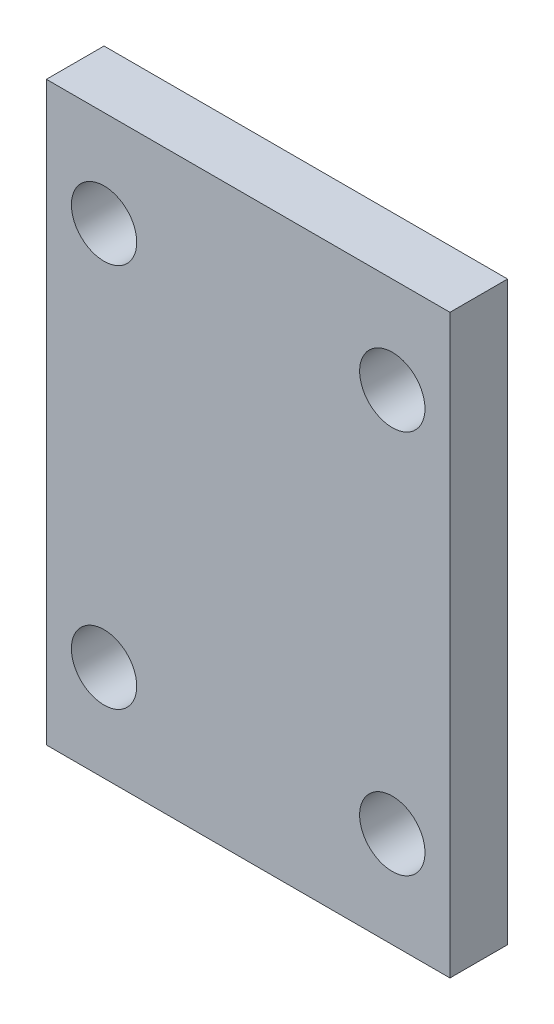
ISO-10303-21;
HEADER;
FILE_DESCRIPTION(('STEP AP214'),'2;1');
FILE_NAME('part.step','',(''),(''),'','','');
FILE_SCHEMA(('AUTOMOTIVE_DESIGN { 1 0 10303 214 1 1 1 1 }'));
ENDSEC;
DATA;
#1=APPLICATION_CONTEXT('core data for automotive mechanical design processes');
#2=APPLICATION_PROTOCOL_DEFINITION('international standard','automotive_design',2000,#1);
#3=PRODUCT_CONTEXT('',#1,'mechanical');
#4=PRODUCT('Part','Part','',(#3));
#5=PRODUCT_RELATED_PRODUCT_CATEGORY('part','',(#4));
#6=PRODUCT_DEFINITION_FORMATION('','',#4);
#7=PRODUCT_DEFINITION_CONTEXT('part definition',#1,'design');
#8=PRODUCT_DEFINITION('design','',#6,#7);
#9=PRODUCT_DEFINITION_SHAPE('','',#8);
#10=(LENGTH_UNIT() NAMED_UNIT(*) SI_UNIT(.MILLI.,.METRE.));
#11=(NAMED_UNIT(*) PLANE_ANGLE_UNIT() SI_UNIT($,.RADIAN.));
#12=(NAMED_UNIT(*) SI_UNIT($,.STERADIAN.) SOLID_ANGLE_UNIT());
#13=UNCERTAINTY_MEASURE_WITH_UNIT(LENGTH_MEASURE(1.E-05),#10,'distance_accuracy_value','');
#14=(GEOMETRIC_REPRESENTATION_CONTEXT(3) GLOBAL_UNCERTAINTY_ASSIGNED_CONTEXT((#13)) GLOBAL_UNIT_ASSIGNED_CONTEXT((#10,
#11,#12)) REPRESENTATION_CONTEXT('',''));
#15=CARTESIAN_POINT('',(0.,0.,0.));
#16=DIRECTION('',(0.,0.,1.));
#17=DIRECTION('',(1.,0.,0.));
#18=AXIS2_PLACEMENT_3D('',#15,#16,#17);
#19=CARTESIAN_POINT('',(0.,0.,0.001215219718688));
#20=DIRECTION('',(0.,0.,1.));
#21=DIRECTION('',(1.,0.,0.));
#22=AXIS2_PLACEMENT_3D('',#19,#20,#21);
#23=PLANE('',#22);
#24=CARTESIAN_POINT('',(18.,25.,0.001215219718915));
#25=DIRECTION('',(0.,0.,1.));
#26=DIRECTION('',(1.,0.,0.));
#27=AXIS2_PLACEMENT_3D('',#24,#25,#26);
#28=CIRCLE('',#27,1.7);
#29=CARTESIAN_POINT('',(19.7,25.,0.001215219718915));
#30=VERTEX_POINT('',#29);
#31=EDGE_CURVE('E90',#30,#30,#28,.T.);
#32=ORIENTED_EDGE('',*,*,#31,.T.);
#33=EDGE_LOOP('',(#32));
#34=FACE_BOUND('',#33,.T.);
#35=CARTESIAN_POINT('',(3.,25.,0.001215219718915));
#36=DIRECTION('',(0.,0.,1.));
#37=DIRECTION('',(1.,0.,0.));
#38=AXIS2_PLACEMENT_3D('',#35,#36,#37);
#39=CIRCLE('',#38,1.7);
#40=CARTESIAN_POINT('',(4.7,25.,0.001215219718915));
#41=VERTEX_POINT('',#40);
#42=EDGE_CURVE('E94',#41,#41,#39,.T.);
#43=ORIENTED_EDGE('',*,*,#42,.T.);
#44=EDGE_LOOP('',(#43));
#45=FACE_BOUND('',#44,.T.);
#46=CARTESIAN_POINT('',(18.,5.,0.001215219718915));
#47=DIRECTION('',(0.,0.,1.));
#48=DIRECTION('',(1.,0.,0.));
#49=AXIS2_PLACEMENT_3D('',#46,#47,#48);
#50=CIRCLE('',#49,1.7);
#51=CARTESIAN_POINT('',(19.7,5.,0.001215219718915));
#52=VERTEX_POINT('',#51);
#53=EDGE_CURVE('E96',#52,#52,#50,.T.);
#54=ORIENTED_EDGE('',*,*,#53,.T.);
#55=EDGE_LOOP('',(#54));
#56=FACE_BOUND('',#55,.T.);
#57=CARTESIAN_POINT('',(3.,5.,0.001215219718915));
#58=DIRECTION('',(0.,0.,1.));
#59=DIRECTION('',(1.,0.,0.));
#60=AXIS2_PLACEMENT_3D('',#57,#58,#59);
#61=CIRCLE('',#60,1.7);
#62=CARTESIAN_POINT('',(4.7,5.,0.001215219718915));
#63=VERTEX_POINT('',#62);
#64=EDGE_CURVE('E19',#63,#63,#61,.T.);
#65=ORIENTED_EDGE('',*,*,#64,.T.);
#66=EDGE_LOOP('',(#65));
#67=FACE_BOUND('',#66,.T.);
#68=DIRECTION('',(0.,1.,0.));
#69=VECTOR('',#68,1.);
#70=CARTESIAN_POINT('',(21.,0.,0.001215219718915));
#71=LINE('',#70,#69);
#72=CARTESIAN_POINT('',(21.,0.,0.00121521971885825));
#73=VERTEX_POINT('',#72);
#74=CARTESIAN_POINT('',(21.,30.,0.0012152197188015));
#75=VERTEX_POINT('',#74);
#76=EDGE_CURVE('E61',#73,#75,#71,.T.);
#77=ORIENTED_EDGE('',*,*,#76,.F.);
#78=DIRECTION('',(1.,0.,0.));
#79=VECTOR('',#78,1.);
#80=CARTESIAN_POINT('',(0.,0.,0.001215219718915));
#81=LINE('',#80,#79);
#82=CARTESIAN_POINT('',(0.,0.,0.0012152197188015));
#83=VERTEX_POINT('',#82);
#84=EDGE_CURVE('E55',#73,#83,#81,.F.);
#85=ORIENTED_EDGE('',*,*,#84,.T.);
#86=DIRECTION('',(0.,1.,0.));
#87=VECTOR('',#86,1.);
#88=CARTESIAN_POINT('',(0.,0.,0.001215219718915));
#89=LINE('',#88,#87);
#90=CARTESIAN_POINT('',(0.,30.,0.0012152197188015));
#91=VERTEX_POINT('',#90);
#92=EDGE_CURVE('E59',#83,#91,#89,.T.);
#93=ORIENTED_EDGE('',*,*,#92,.T.);
#94=DIRECTION('',(1.,0.,0.));
#95=VECTOR('',#94,1.);
#96=CARTESIAN_POINT('',(0.,30.,0.001215219718915));
#97=LINE('',#96,#95);
#98=EDGE_CURVE('E105',#75,#91,#97,.F.);
#99=ORIENTED_EDGE('',*,*,#98,.F.);
#100=EDGE_LOOP('',(#77,#85,#93,#99));
#101=FACE_BOUND('',#100,.T.);
#102=ADVANCED_FACE('F16',(#34,#45,#56,#67,#101),#23,.F.);
#103=CARTESIAN_POINT('',(0.,0.,0.001215219718688));
#104=DIRECTION('',(1.,0.,0.));
#105=DIRECTION('',(0.,0.,-1.));
#106=AXIS2_PLACEMENT_3D('',#103,#104,#105);
#107=PLANE('',#106);
#108=DIRECTION('',(0.,0.,1.));
#109=VECTOR('',#108,1.);
#110=CARTESIAN_POINT('',(0.,30.,0.001215219718688));
#111=LINE('',#110,#109);
#112=CARTESIAN_POINT('',(0.,30.,3.001215219719));
#113=VERTEX_POINT('',#112);
#114=EDGE_CURVE('E69',#91,#113,#111,.T.);
#115=ORIENTED_EDGE('',*,*,#114,.F.);
#116=ORIENTED_EDGE('',*,*,#92,.F.);
#117=DIRECTION('',(0.,0.,1.));
#118=VECTOR('',#117,1.);
#119=CARTESIAN_POINT('',(0.,0.,0.001215219718688));
#120=LINE('',#119,#118);
#121=CARTESIAN_POINT('',(0.,0.,3.001215219719));
#122=VERTEX_POINT('',#121);
#123=EDGE_CURVE('E63',#83,#122,#120,.T.);
#124=ORIENTED_EDGE('',*,*,#123,.T.);
#125=DIRECTION('',(0.,1.,0.));
#126=VECTOR('',#125,1.);
#127=CARTESIAN_POINT('',(0.,0.,3.001215219719));
#128=LINE('',#127,#126);
#129=EDGE_CURVE('E93',#113,#122,#128,.F.);
#130=ORIENTED_EDGE('',*,*,#129,.F.);
#131=EDGE_LOOP('',(#115,#116,#124,#130));
#132=FACE_BOUND('',#131,.T.);
#133=ADVANCED_FACE('F66',(#132),#107,.F.);
#134=CARTESIAN_POINT('',(0.,0.,0.001215219718688));
#135=DIRECTION('',(0.,1.,0.));
#136=DIRECTION('',(0.,0.,1.));
#137=AXIS2_PLACEMENT_3D('',#134,#135,#136);
#138=PLANE('',#137);
#139=DIRECTION('',(1.,0.,0.));
#140=VECTOR('',#139,1.);
#141=CARTESIAN_POINT('',(0.,0.,3.001215219719));
#142=LINE('',#141,#140);
#143=CARTESIAN_POINT('',(21.,0.,3.001215219719));
#144=VERTEX_POINT('',#143);
#145=EDGE_CURVE('E74',#122,#144,#142,.T.);
#146=ORIENTED_EDGE('',*,*,#145,.F.);
#147=ORIENTED_EDGE('',*,*,#123,.F.);
#148=ORIENTED_EDGE('',*,*,#84,.F.);
#149=DIRECTION('',(0.,0.,-1.));
#150=VECTOR('',#149,1.);
#151=CARTESIAN_POINT('',(21.,0.,0.001215219718688));
#152=LINE('',#151,#150);
#153=EDGE_CURVE('E76',#144,#73,#152,.T.);
#154=ORIENTED_EDGE('',*,*,#153,.F.);
#155=EDGE_LOOP('',(#146,#147,#148,#154));
#156=FACE_BOUND('',#155,.T.);
#157=ADVANCED_FACE('F72',(#156),#138,.F.);
#158=CARTESIAN_POINT('',(21.,0.,0.001215219718688));
#159=DIRECTION('',(1.,0.,0.));
#160=DIRECTION('',(0.,0.,-1.));
#161=AXIS2_PLACEMENT_3D('',#158,#159,#160);
#162=PLANE('',#161);
#163=DIRECTION('',(0.,0.,1.));
#164=VECTOR('',#163,1.);
#165=CARTESIAN_POINT('',(21.,30.,0.001215219718688));
#166=LINE('',#165,#164);
#167=CARTESIAN_POINT('',(21.,30.,3.001215219719));
#168=VERTEX_POINT('',#167);
#169=EDGE_CURVE('E34',#168,#75,#166,.F.);
#170=ORIENTED_EDGE('',*,*,#169,.F.);
#171=DIRECTION('',(0.,1.,0.));
#172=VECTOR('',#171,1.);
#173=CARTESIAN_POINT('',(21.,0.,3.001215219719));
#174=LINE('',#173,#172);
#175=EDGE_CURVE('E112',#144,#168,#174,.T.);
#176=ORIENTED_EDGE('',*,*,#175,.F.);
#177=ORIENTED_EDGE('',*,*,#153,.T.);
#178=ORIENTED_EDGE('',*,*,#76,.T.);
#179=EDGE_LOOP('',(#170,#176,#177,#178));
#180=FACE_BOUND('',#179,.T.);
#181=ADVANCED_FACE('F110',(#180),#162,.T.);
#182=CARTESIAN_POINT('',(0.,30.,0.001215219718688));
#183=DIRECTION('',(0.,1.,0.));
#184=DIRECTION('',(0.,0.,1.));
#185=AXIS2_PLACEMENT_3D('',#182,#183,#184);
#186=PLANE('',#185);
#187=DIRECTION('',(1.,0.,0.));
#188=VECTOR('',#187,1.);
#189=CARTESIAN_POINT('',(0.,30.,3.001215219719));
#190=LINE('',#189,#188);
#191=EDGE_CURVE('E89',#168,#113,#190,.F.);
#192=ORIENTED_EDGE('',*,*,#191,.F.);
#193=ORIENTED_EDGE('',*,*,#169,.T.);
#194=ORIENTED_EDGE('',*,*,#98,.T.);
#195=ORIENTED_EDGE('',*,*,#114,.T.);
#196=EDGE_LOOP('',(#192,#193,#194,#195));
#197=FACE_BOUND('',#196,.T.);
#198=ADVANCED_FACE('F118',(#197),#186,.T.);
#199=CARTESIAN_POINT('',(3.,5.,0.001215219718688));
#200=DIRECTION('',(0.,0.,1.));
#201=DIRECTION('',(1.,0.,0.));
#202=AXIS2_PLACEMENT_3D('',#199,#200,#201);
#203=CYLINDRICAL_SURFACE('',#202,1.7);
#204=ORIENTED_EDGE('',*,*,#64,.F.);
#205=EDGE_LOOP('',(#204));
#206=FACE_BOUND('',#205,.T.);
#207=CARTESIAN_POINT('',(3.,5.,3.001215219719));
#208=DIRECTION('',(0.,0.,1.));
#209=DIRECTION('',(1.,0.,0.));
#210=AXIS2_PLACEMENT_3D('',#207,#208,#209);
#211=CIRCLE('',#210,1.7);
#212=CARTESIAN_POINT('',(4.7,5.,3.001215219719));
#213=VERTEX_POINT('',#212);
#214=EDGE_CURVE('E86',#213,#213,#211,.F.);
#215=ORIENTED_EDGE('',*,*,#214,.F.);
#216=EDGE_LOOP('',(#215));
#217=FACE_BOUND('',#216,.T.);
#218=ADVANCED_FACE('F120',(#206,#217),#203,.F.);
#219=CARTESIAN_POINT('',(18.,5.,0.001215219718688));
#220=DIRECTION('',(0.,0.,1.));
#221=DIRECTION('',(1.,0.,0.));
#222=AXIS2_PLACEMENT_3D('',#219,#220,#221);
#223=CYLINDRICAL_SURFACE('',#222,1.7);
#224=ORIENTED_EDGE('',*,*,#53,.F.);
#225=EDGE_LOOP('',(#224));
#226=FACE_BOUND('',#225,.T.);
#227=CARTESIAN_POINT('',(18.,5.,3.001215219719));
#228=DIRECTION('',(0.,0.,1.));
#229=DIRECTION('',(1.,0.,0.));
#230=AXIS2_PLACEMENT_3D('',#227,#228,#229);
#231=CIRCLE('',#230,1.7);
#232=CARTESIAN_POINT('',(19.7,5.,3.001215219719));
#233=VERTEX_POINT('',#232);
#234=EDGE_CURVE('E83',#233,#233,#231,.F.);
#235=ORIENTED_EDGE('',*,*,#234,.F.);
#236=EDGE_LOOP('',(#235));
#237=FACE_BOUND('',#236,.T.);
#238=ADVANCED_FACE('F127',(#226,#237),#223,.F.);
#239=CARTESIAN_POINT('',(3.,25.,0.001215219718688));
#240=DIRECTION('',(0.,0.,1.));
#241=DIRECTION('',(1.,0.,0.));
#242=AXIS2_PLACEMENT_3D('',#239,#240,#241);
#243=CYLINDRICAL_SURFACE('',#242,1.7);
#244=ORIENTED_EDGE('',*,*,#42,.F.);
#245=EDGE_LOOP('',(#244));
#246=FACE_BOUND('',#245,.T.);
#247=CARTESIAN_POINT('',(3.,25.,3.001215219719));
#248=DIRECTION('',(0.,0.,1.));
#249=DIRECTION('',(1.,0.,0.));
#250=AXIS2_PLACEMENT_3D('',#247,#248,#249);
#251=CIRCLE('',#250,1.7);
#252=CARTESIAN_POINT('',(4.7,25.,3.001215219719));
#253=VERTEX_POINT('',#252);
#254=EDGE_CURVE('E25',#253,#253,#251,.F.);
#255=ORIENTED_EDGE('',*,*,#254,.F.);
#256=EDGE_LOOP('',(#255));
#257=FACE_BOUND('',#256,.T.);
#258=ADVANCED_FACE('F138',(#246,#257),#243,.F.);
#259=CARTESIAN_POINT('',(18.,25.,0.001215219718688));
#260=DIRECTION('',(0.,0.,1.));
#261=DIRECTION('',(1.,0.,0.));
#262=AXIS2_PLACEMENT_3D('',#259,#260,#261);
#263=CYLINDRICAL_SURFACE('',#262,1.7);
#264=ORIENTED_EDGE('',*,*,#31,.F.);
#265=EDGE_LOOP('',(#264));
#266=FACE_BOUND('',#265,.T.);
#267=CARTESIAN_POINT('',(18.,25.,3.001215219719));
#268=DIRECTION('',(0.,0.,1.));
#269=DIRECTION('',(1.,0.,0.));
#270=AXIS2_PLACEMENT_3D('',#267,#268,#269);
#271=CIRCLE('',#270,1.7);
#272=CARTESIAN_POINT('',(19.7,25.,3.001215219719));
#273=VERTEX_POINT('',#272);
#274=EDGE_CURVE('E11',#273,#273,#271,.F.);
#275=ORIENTED_EDGE('',*,*,#274,.F.);
#276=EDGE_LOOP('',(#275));
#277=FACE_BOUND('',#276,.T.);
#278=ADVANCED_FACE('F132',(#266,#277),#263,.F.);
#279=CARTESIAN_POINT('',(0.,0.,3.001215219719));
#280=DIRECTION('',(0.,0.,1.));
#281=DIRECTION('',(1.,0.,0.));
#282=AXIS2_PLACEMENT_3D('',#279,#280,#281);
#283=PLANE('',#282);
#284=ORIENTED_EDGE('',*,*,#274,.T.);
#285=EDGE_LOOP('',(#284));
#286=FACE_BOUND('',#285,.T.);
#287=ORIENTED_EDGE('',*,*,#254,.T.);
#288=EDGE_LOOP('',(#287));
#289=FACE_BOUND('',#288,.T.);
#290=ORIENTED_EDGE('',*,*,#234,.T.);
#291=EDGE_LOOP('',(#290));
#292=FACE_BOUND('',#291,.T.);
#293=ORIENTED_EDGE('',*,*,#214,.T.);
#294=EDGE_LOOP('',(#293));
#295=FACE_BOUND('',#294,.T.);
#296=ORIENTED_EDGE('',*,*,#175,.T.);
#297=ORIENTED_EDGE('',*,*,#191,.T.);
#298=ORIENTED_EDGE('',*,*,#129,.T.);
#299=ORIENTED_EDGE('',*,*,#145,.T.);
#300=EDGE_LOOP('',(#296,#297,#298,#299));
#301=FACE_BOUND('',#300,.T.);
#302=ADVANCED_FACE('F116',(#286,#289,#292,#295,#301),#283,.T.);
#303=CLOSED_SHELL('',(#102,#133,#157,#181,#198,#218,#238,#258,#278,#302));
#304=MANIFOLD_SOLID_BREP('B1',#303);
#305=ADVANCED_BREP_SHAPE_REPRESENTATION('',(#18,#304),#14);
#306=SHAPE_DEFINITION_REPRESENTATION(#9,#305);
ENDSEC;
END-ISO-10303-21;
